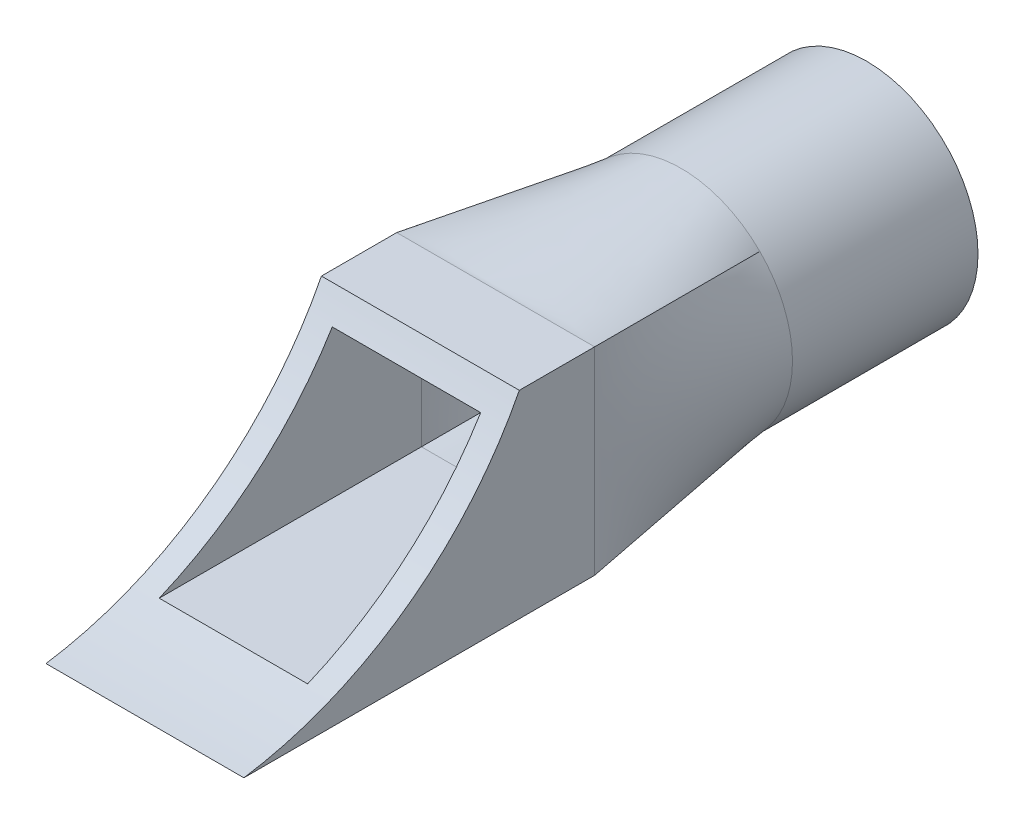
ISO-10303-21;
HEADER;
FILE_DESCRIPTION(('STEP AP214'),'2;1');
FILE_NAME('part.step','',(''),(''),'','','');
FILE_SCHEMA(('AUTOMOTIVE_DESIGN { 1 0 10303 214 1 1 1 1 }'));
ENDSEC;
DATA;
#1=APPLICATION_CONTEXT('core data for automotive mechanical design processes');
#2=APPLICATION_PROTOCOL_DEFINITION('international standard','automotive_design',2000,#1);
#3=PRODUCT_CONTEXT('',#1,'mechanical');
#4=PRODUCT('Part','Part','',(#3));
#5=PRODUCT_RELATED_PRODUCT_CATEGORY('part','',(#4));
#6=PRODUCT_DEFINITION_FORMATION('','',#4);
#7=PRODUCT_DEFINITION_CONTEXT('part definition',#1,'design');
#8=PRODUCT_DEFINITION('design','',#6,#7);
#9=PRODUCT_DEFINITION_SHAPE('','',#8);
#10=(LENGTH_UNIT() NAMED_UNIT(*) SI_UNIT(.MILLI.,.METRE.));
#11=(NAMED_UNIT(*) PLANE_ANGLE_UNIT() SI_UNIT($,.RADIAN.));
#12=(NAMED_UNIT(*) SI_UNIT($,.STERADIAN.) SOLID_ANGLE_UNIT());
#13=UNCERTAINTY_MEASURE_WITH_UNIT(LENGTH_MEASURE(1.E-05),#10,'distance_accuracy_value','');
#14=(GEOMETRIC_REPRESENTATION_CONTEXT(3) GLOBAL_UNCERTAINTY_ASSIGNED_CONTEXT((#13)) GLOBAL_UNIT_ASSIGNED_CONTEXT((#10,
#11,#12)) REPRESENTATION_CONTEXT('',''));
#15=CARTESIAN_POINT('',(0.,0.,0.));
#16=DIRECTION('',(0.,0.,1.));
#17=DIRECTION('',(1.,0.,0.));
#18=AXIS2_PLACEMENT_3D('',#15,#16,#17);
#19=CARTESIAN_POINT('',(-62.7874671161702,176.354700098905,15.));
#20=CARTESIAN_POINT('',(-61.1514281468492,174.718661129584,0.));
#21=CARTESIAN_POINT('',(-62.1208004495035,176.354700098905,15.));
#22=CARTESIAN_POINT('',(-60.7764281468491,175.093661129584,0.));
#23=CARTESIAN_POINT('',(-61.4541337828369,176.354700098905,15.));
#24=CARTESIAN_POINT('',(-60.3540678350133,175.44934816563,0.));
#25=CARTESIAN_POINT('',(-60.1208004495035,176.354700098905,15.));
#26=CARTESIAN_POINT('',(-59.4202889398995,176.09149767305,0.));
#27=CARTESIAN_POINT('',(-59.4541337828368,176.354700098905,15.));
#28=CARTESIAN_POINT('',(-58.9088226708507,176.377752232849,0.));
#29=CARTESIAN_POINT('',(-58.1208004495035,176.354700098905,15.));
#30=CARTESIAN_POINT('',(-57.815303816473,176.851001768948,0.));
#31=CARTESIAN_POINT('',(-57.4541337828368,176.354700098905,15.));
#32=CARTESIAN_POINT('',(-57.233336843669,177.03776478314,0.));
#33=CARTESIAN_POINT('',(-56.1208004495035,176.354700098905,15.));
#34=CARTESIAN_POINT('',(-56.0299679288679,177.289692139469,0.));
#35=CARTESIAN_POINT('',(-55.4541337828368,176.354700098905,15.));
#36=CARTESIAN_POINT('',(-55.4087874597299,177.354700098905,0.));
#37=CARTESIAN_POINT('',(-54.1208004495035,176.354700098905,15.));
#38=CARTESIAN_POINT('',(-54.1661467726106,177.354700098905,0.));
#39=CARTESIAN_POINT('',(-53.4541337828368,176.354700098905,15.));
#40=CARTESIAN_POINT('',(-53.5449663034725,177.289692139469,0.));
#41=CARTESIAN_POINT('',(-52.1208004495035,176.354700098905,15.));
#42=CARTESIAN_POINT('',(-52.3415973886715,177.03776478314,0.));
#43=CARTESIAN_POINT('',(-51.4541337828368,176.354700098905,15.));
#44=CARTESIAN_POINT('',(-51.7596304158674,176.851001768948,0.));
#45=CARTESIAN_POINT('',(-50.1208004495035,176.354700098905,15.));
#46=CARTESIAN_POINT('',(-50.6661115614897,176.377752232849,0.));
#47=CARTESIAN_POINT('',(-49.4541337828369,176.354700098905,15.));
#48=CARTESIAN_POINT('',(-50.1546452924409,176.09149767305,0.));
#49=CARTESIAN_POINT('',(-48.1208004495035,176.354700098905,15.));
#50=CARTESIAN_POINT('',(-49.2208663973272,175.44934816563,0.));
#51=CARTESIAN_POINT('',(-47.4541337828369,176.354700098905,15.));
#52=CARTESIAN_POINT('',(-48.7985060854913,175.093661129584,0.));
#53=CARTESIAN_POINT('',(-46.7874671161702,176.354700098905,15.));
#54=CARTESIAN_POINT('',(-48.4235060854913,174.718661129584,0.));
#55=B_SPLINE_SURFACE_WITH_KNOTS('',3,1,((#19,#20),(#21,#22),(#23,#24),(#25,#26),(#27,#28),(#29,
#30),(#31,#32),(#33,#34),(#35,#36),(#37,#38),(#39,#40),(#41,#42),(#43,#44),(#45,#46),(#47,#48),
(#49,#50),(#51,#52),(#53,#54)),.UNSPECIFIED.,.F.,.F.,.F.,(4,2,2,2,2,2,2,2,4),(2,2),(0.,0.125,
0.25,0.375,0.5,0.625,0.75,0.875,1.),(0.,1.),.UNSPECIFIED.);
#56=DIRECTION('',(1.,0.,0.));
#57=VECTOR('',#56,1.);
#58=CARTESIAN_POINT('',(-62.7874671161702,176.354700098905,15.));
#59=LINE('',#58,#57);
#60=CARTESIAN_POINT('',(-62.7874671161702,176.354700098905,15.));
#61=VERTEX_POINT('',#60);
#62=CARTESIAN_POINT('',(-46.7874671161702,176.354700098905,15.));
#63=VERTEX_POINT('',#62);
#64=EDGE_CURVE('E223',#61,#63,#59,.T.);
#65=DIRECTION('',(-0.107794468345161,-0.107794468345161,-0.988312048488921));
#66=VECTOR('',#65,1.);
#67=CARTESIAN_POINT('',(-47.6054866008308,175.536680614245,7.5));
#68=LINE('',#67,#66);
#69=CARTESIAN_POINT('',(-48.4235060854913,174.718661129584,0.));
#70=VERTEX_POINT('',#69);
#71=EDGE_CURVE('E254',#63,#70,#68,.T.);
#72=CARTESIAN_POINT('',(-54.7874671161702,168.354700098905,0.));
#73=DIRECTION('',(0.,0.,1.));
#74=DIRECTION('',(1.,0.,0.));
#75=AXIS2_PLACEMENT_3D('',#72,#73,#74);
#76=CIRCLE('',#75,9.00000000000001);
#77=CARTESIAN_POINT('',(-61.1514281468492,174.718661129584,0.));
#78=VERTEX_POINT('',#77);
#79=EDGE_CURVE('E120',#70,#78,#76,.T.);
#80=DIRECTION('',(-0.107794468345161,0.107794468345161,0.988312048488921));
#81=VECTOR('',#80,1.);
#82=CARTESIAN_POINT('',(-61.9694476315097,175.536680614245,7.5));
#83=LINE('',#82,#81);
#84=EDGE_CURVE('E240',#78,#61,#83,.T.);
#85=ORIENTED_EDGE('',*,*,#64,.T.);
#86=ORIENTED_EDGE('',*,*,#71,.T.);
#87=ORIENTED_EDGE('',*,*,#79,.T.);
#88=ORIENTED_EDGE('',*,*,#84,.T.);
#89=EDGE_LOOP('',(#85,#86,#87,#88));
#90=FACE_BOUND('',#89,.T.);
#91=ADVANCED_FACE('F99',(#90),#55,.T.);
#92=CARTESIAN_POINT('',(-46.7874671161702,176.354700098905,15.));
#93=CARTESIAN_POINT('',(-48.4235060854913,174.718661129584,0.));
#94=CARTESIAN_POINT('',(-46.7874671161702,175.688033432239,15.));
#95=CARTESIAN_POINT('',(-48.0485060854913,174.343661129584,0.));
#96=CARTESIAN_POINT('',(-46.7874671161702,175.021366765572,15.));
#97=CARTESIAN_POINT('',(-47.6928190494452,173.921300817748,0.));
#98=CARTESIAN_POINT('',(-46.7874671161702,173.688033432238,15.));
#99=CARTESIAN_POINT('',(-47.0506695420258,172.987521922635,0.));
#100=CARTESIAN_POINT('',(-46.7874671161702,173.021366765572,15.));
#101=CARTESIAN_POINT('',(-46.7644149822265,172.476055653586,0.));
#102=CARTESIAN_POINT('',(-46.7874671161702,171.688033432238,15.));
#103=CARTESIAN_POINT('',(-46.2911654461273,171.382536799208,0.));
#104=CARTESIAN_POINT('',(-46.7874671161702,171.021366765572,15.));
#105=CARTESIAN_POINT('',(-46.1044024319358,170.800569826404,0.));
#106=CARTESIAN_POINT('',(-46.7874671161702,169.688033432238,15.));
#107=CARTESIAN_POINT('',(-45.8524750756063,169.597200911603,0.));
#108=CARTESIAN_POINT('',(-46.7874671161702,169.021366765572,15.));
#109=CARTESIAN_POINT('',(-45.7874671161702,168.976020442465,0.));
#110=CARTESIAN_POINT('',(-46.7874671161702,167.688033432238,15.));
#111=CARTESIAN_POINT('',(-45.7874671161702,167.733379755346,0.));
#112=CARTESIAN_POINT('',(-46.7874671161702,167.021366765572,15.));
#113=CARTESIAN_POINT('',(-45.8524750756063,167.112199286207,0.));
#114=CARTESIAN_POINT('',(-46.7874671161702,165.688033432238,15.));
#115=CARTESIAN_POINT('',(-46.1044024319358,165.908830371406,0.));
#116=CARTESIAN_POINT('',(-46.7874671161702,165.021366765572,15.));
#117=CARTESIAN_POINT('',(-46.2911654461273,165.326863398602,0.));
#118=CARTESIAN_POINT('',(-46.7874671161702,163.688033432238,15.));
#119=CARTESIAN_POINT('',(-46.7644149822265,164.233344544225,0.));
#120=CARTESIAN_POINT('',(-46.7874671161702,163.021366765572,15.));
#121=CARTESIAN_POINT('',(-47.0506695420258,163.721878275176,0.));
#122=CARTESIAN_POINT('',(-46.7874671161702,161.688033432239,15.));
#123=CARTESIAN_POINT('',(-47.6928190494452,162.788099380062,0.));
#124=CARTESIAN_POINT('',(-46.7874671161702,161.021366765572,15.));
#125=CARTESIAN_POINT('',(-48.0485060854913,162.365739068226,0.));
#126=CARTESIAN_POINT('',(-46.7874671161702,160.354700098905,15.));
#127=CARTESIAN_POINT('',(-48.4235060854913,161.990739068226,0.));
#128=B_SPLINE_SURFACE_WITH_KNOTS('',3,1,((#92,#93),(#94,#95),(#96,#97),(#98,#99),(#100,#101),
(#102,#103),(#104,#105),(#106,#107),(#108,#109),(#110,#111),(#112,#113),(#114,#115),(#116,#117),
(#118,#119),(#120,#121),(#122,#123),(#124,#125),(#126,#127)),.UNSPECIFIED.,.F.,.F.,.F.,(4,2,2,2,
2,2,2,2,4),(2,2),(0.,0.125,0.25,0.375,0.5,0.625,0.75,0.875,1.),(0.,1.),.UNSPECIFIED.);
#129=DIRECTION('',(0.,1.,0.));
#130=VECTOR('',#129,1.);
#131=CARTESIAN_POINT('',(-46.7874671161702,160.354700098905,15.));
#132=LINE('',#131,#130);
#133=CARTESIAN_POINT('',(-46.7874671161702,160.354700098905,15.));
#134=VERTEX_POINT('',#133);
#135=EDGE_CURVE('E129',#134,#63,#132,.T.);
#136=DIRECTION('',(-0.107794468345161,0.107794468345161,-0.988312048488921));
#137=VECTOR('',#136,1.);
#138=CARTESIAN_POINT('',(-47.6054866008308,161.172719583566,7.5));
#139=LINE('',#138,#137);
#140=CARTESIAN_POINT('',(-48.4235060854913,161.990739068226,0.));
#141=VERTEX_POINT('',#140);
#142=EDGE_CURVE('E235',#134,#141,#139,.T.);
#143=EDGE_CURVE('E112',#141,#70,#76,.T.);
#144=ORIENTED_EDGE('',*,*,#135,.F.);
#145=ORIENTED_EDGE('',*,*,#142,.T.);
#146=ORIENTED_EDGE('',*,*,#143,.T.);
#147=ORIENTED_EDGE('',*,*,#71,.F.);
#148=EDGE_LOOP('',(#144,#145,#146,#147));
#149=FACE_BOUND('',#148,.T.);
#150=ADVANCED_FACE('F273',(#149),#128,.T.);
#151=CARTESIAN_POINT('',(-62.7874671161702,160.354700098905,15.));
#152=CARTESIAN_POINT('',(-61.1514281468492,161.990739068226,0.));
#153=CARTESIAN_POINT('',(-62.7874671161702,161.021366765572,15.));
#154=CARTESIAN_POINT('',(-61.5264281468492,162.365739068226,0.));
#155=CARTESIAN_POINT('',(-62.7874671161702,161.688033432239,15.));
#156=CARTESIAN_POINT('',(-61.8821151828953,162.788099380062,0.));
#157=CARTESIAN_POINT('',(-62.7874671161702,163.021366765572,15.));
#158=CARTESIAN_POINT('',(-62.5242646903147,163.721878275176,0.));
#159=CARTESIAN_POINT('',(-62.7874671161702,163.688033432239,15.));
#160=CARTESIAN_POINT('',(-62.8105192501139,164.233344544225,0.));
#161=CARTESIAN_POINT('',(-62.7874671161702,165.021366765572,15.));
#162=CARTESIAN_POINT('',(-63.2837687862132,165.326863398602,0.));
#163=CARTESIAN_POINT('',(-62.7874671161702,165.688033432239,15.));
#164=CARTESIAN_POINT('',(-63.4705318004047,165.908830371406,0.));
#165=CARTESIAN_POINT('',(-62.7874671161702,167.021366765572,15.));
#166=CARTESIAN_POINT('',(-63.7224591567341,167.112199286208,0.));
#167=CARTESIAN_POINT('',(-62.7874671161702,167.688033432239,15.));
#168=CARTESIAN_POINT('',(-63.7874671161702,167.733379755346,0.));
#169=CARTESIAN_POINT('',(-62.7874671161702,169.021366765572,15.));
#170=CARTESIAN_POINT('',(-63.7874671161703,168.976020442465,0.));
#171=CARTESIAN_POINT('',(-62.7874671161702,169.688033432239,15.));
#172=CARTESIAN_POINT('',(-63.7224591567341,169.597200911603,0.));
#173=CARTESIAN_POINT('',(-62.7874671161702,171.021366765572,15.));
#174=CARTESIAN_POINT('',(-63.4705318004047,170.800569826404,0.));
#175=CARTESIAN_POINT('',(-62.7874671161702,171.688033432239,15.));
#176=CARTESIAN_POINT('',(-63.2837687862131,171.382536799208,0.));
#177=CARTESIAN_POINT('',(-62.7874671161702,173.021366765572,15.));
#178=CARTESIAN_POINT('',(-62.810519250114,172.476055653586,0.));
#179=CARTESIAN_POINT('',(-62.7874671161702,173.688033432239,15.));
#180=CARTESIAN_POINT('',(-62.5242646903147,172.987521922635,0.));
#181=CARTESIAN_POINT('',(-62.7874671161702,175.021366765572,15.));
#182=CARTESIAN_POINT('',(-61.8821151828953,173.921300817748,0.));
#183=CARTESIAN_POINT('',(-62.7874671161702,175.688033432239,15.));
#184=CARTESIAN_POINT('',(-61.5264281468492,174.343661129584,0.));
#185=CARTESIAN_POINT('',(-62.7874671161702,176.354700098905,15.));
#186=CARTESIAN_POINT('',(-61.1514281468492,174.718661129584,0.));
#187=B_SPLINE_SURFACE_WITH_KNOTS('',3,1,((#151,#152),(#153,#154),(#155,#156),(#157,#158),(#159,
#160),(#161,#162),(#163,#164),(#165,#166),(#167,#168),(#169,#170),(#171,#172),(#173,#174),(#175,
#176),(#177,#178),(#179,#180),(#181,#182),(#183,#184),(#185,#186)),.UNSPECIFIED.,.F.,.F.,.F.,(4,
2,2,2,2,2,2,2,4),(2,2),(0.,0.125,0.25,0.375,0.5,0.624999999999999,0.749999999999999,
0.874999999999999,1.),(0.,1.),.UNSPECIFIED.);
#188=DIRECTION('',(0.,1.,0.));
#189=VECTOR('',#188,1.);
#190=CARTESIAN_POINT('',(-62.7874671161702,160.354700098905,15.));
#191=LINE('',#190,#189);
#192=CARTESIAN_POINT('',(-62.7874671161702,160.354700098905,15.));
#193=VERTEX_POINT('',#192);
#194=EDGE_CURVE('E212',#193,#61,#191,.T.);
#195=CARTESIAN_POINT('',(-61.1514281468492,161.990739068226,0.));
#196=VERTEX_POINT('',#195);
#197=EDGE_CURVE('E232',#78,#196,#76,.T.);
#198=DIRECTION('',(0.10779446834516,0.107794468345161,-0.988312048488921));
#199=VECTOR('',#198,1.);
#200=CARTESIAN_POINT('',(-61.9694476315097,161.172719583566,7.5));
#201=LINE('',#200,#199);
#202=EDGE_CURVE('E230',#193,#196,#201,.T.);
#203=ORIENTED_EDGE('',*,*,#194,.T.);
#204=ORIENTED_EDGE('',*,*,#84,.F.);
#205=ORIENTED_EDGE('',*,*,#197,.T.);
#206=ORIENTED_EDGE('',*,*,#202,.F.);
#207=EDGE_LOOP('',(#203,#204,#205,#206));
#208=FACE_BOUND('',#207,.T.);
#209=ADVANCED_FACE('F231',(#208),#187,.T.);
#210=CARTESIAN_POINT('',(-46.7874671161702,160.354700098905,15.));
#211=CARTESIAN_POINT('',(-48.4235060854913,161.990739068226,0.));
#212=CARTESIAN_POINT('',(-47.4541337828368,160.354700098905,15.));
#213=CARTESIAN_POINT('',(-48.7985060854913,161.615739068226,0.));
#214=CARTESIAN_POINT('',(-48.1208004495034,160.354700098905,15.));
#215=CARTESIAN_POINT('',(-49.2208663973272,161.26005203218,0.));
#216=CARTESIAN_POINT('',(-49.4541337828366,160.354700098905,15.));
#217=CARTESIAN_POINT('',(-50.1546452924409,160.617902524761,0.));
#218=CARTESIAN_POINT('',(-50.1208004495032,160.354700098905,15.));
#219=CARTESIAN_POINT('',(-50.6661115614897,160.331647964961,0.));
#220=CARTESIAN_POINT('',(-51.4541337828365,160.354700098905,15.));
#221=CARTESIAN_POINT('',(-51.7596304158674,159.858398428862,0.));
#222=CARTESIAN_POINT('',(-52.1208004495031,160.354700098905,15.));
#223=CARTESIAN_POINT('',(-52.3415973886715,159.671635414671,0.));
#224=CARTESIAN_POINT('',(-53.4541337828364,160.354700098905,15.));
#225=CARTESIAN_POINT('',(-53.5449663034725,159.419708058341,0.));
#226=CARTESIAN_POINT('',(-54.120800449503,160.354700098905,15.));
#227=CARTESIAN_POINT('',(-54.1661467726106,159.354700098905,0.));
#228=CARTESIAN_POINT('',(-55.4541337828364,160.354700098905,15.));
#229=CARTESIAN_POINT('',(-55.4087874597299,159.354700098905,0.));
#230=CARTESIAN_POINT('',(-56.120800449503,160.354700098905,15.));
#231=CARTESIAN_POINT('',(-56.0299679288679,159.419708058341,0.));
#232=CARTESIAN_POINT('',(-57.4541337828364,160.354700098905,15.));
#233=CARTESIAN_POINT('',(-57.233336843669,159.671635414671,0.));
#234=CARTESIAN_POINT('',(-58.1208004495031,160.354700098905,15.));
#235=CARTESIAN_POINT('',(-57.815303816473,159.858398428862,0.));
#236=CARTESIAN_POINT('',(-59.4541337828365,160.354700098905,15.));
#237=CARTESIAN_POINT('',(-58.9088226708507,160.331647964961,0.));
#238=CARTESIAN_POINT('',(-60.1208004495033,160.354700098905,15.));
#239=CARTESIAN_POINT('',(-59.4202889398996,160.617902524761,0.));
#240=CARTESIAN_POINT('',(-61.4541337828367,160.354700098905,15.));
#241=CARTESIAN_POINT('',(-60.3540678350133,161.26005203218,0.));
#242=CARTESIAN_POINT('',(-62.1208004495035,160.354700098905,15.));
#243=CARTESIAN_POINT('',(-60.7764281468492,161.615739068226,0.));
#244=CARTESIAN_POINT('',(-62.7874671161702,160.354700098905,15.));
#245=CARTESIAN_POINT('',(-61.1514281468492,161.990739068226,0.));
#246=B_SPLINE_SURFACE_WITH_KNOTS('',3,1,((#210,#211),(#212,#213),(#214,#215),(#216,#217),(#218,
#219),(#220,#221),(#222,#223),(#224,#225),(#226,#227),(#228,#229),(#230,#231),(#232,#233),(#234,
#235),(#236,#237),(#238,#239),(#240,#241),(#242,#243),(#244,#245)),.UNSPECIFIED.,.F.,.F.,.F.,(4,
2,2,2,2,2,2,2,4),(2,2),(0.,0.125,0.25,0.375,0.5,0.625,0.75,0.875,1.),(0.,1.),.UNSPECIFIED.);
#247=DIRECTION('',(1.,0.,0.));
#248=VECTOR('',#247,1.);
#249=CARTESIAN_POINT('',(-62.7874671161702,160.354700098905,15.));
#250=LINE('',#249,#248);
#251=EDGE_CURVE('E203',#193,#134,#250,.T.);
#252=EDGE_CURVE('E12',#196,#141,#76,.T.);
#253=ORIENTED_EDGE('',*,*,#251,.F.);
#254=ORIENTED_EDGE('',*,*,#202,.T.);
#255=ORIENTED_EDGE('',*,*,#252,.T.);
#256=ORIENTED_EDGE('',*,*,#142,.F.);
#257=EDGE_LOOP('',(#253,#254,#255,#256));
#258=FACE_BOUND('',#257,.T.);
#259=ADVANCED_FACE('F101',(#258),#246,.T.);
#260=CARTESIAN_POINT('',(-59.7372145844761,173.304447567211,0.));
#261=CARTESIAN_POINT('',(-60.7874671161702,174.354700098905,15.));
#262=CARTESIAN_POINT('',(-60.0288812511427,173.012780900544,0.));
#263=CARTESIAN_POINT('',(-60.7874671161702,173.854700098906,15.));
#264=CARTESIAN_POINT('',(-60.3055267236231,172.684278435783,0.));
#265=CARTESIAN_POINT('',(-60.7874671161702,173.354700098906,15.));
#266=CARTESIAN_POINT('',(-60.8049763405048,171.958005961806,0.));
#267=CARTESIAN_POINT('',(-60.7874671161702,172.354700098906,15.));
#268=CARTESIAN_POINT('',(-61.0276187759042,171.560198863657,0.));
#269=CARTESIAN_POINT('',(-60.7874671161702,171.854700098907,15.));
#270=CARTESIAN_POINT('',(-61.3957017484258,170.709684199141,0.));
#271=CARTESIAN_POINT('',(-60.7874671161702,170.854700098907,15.));
#272=CARTESIAN_POINT('',(-61.5409618705748,170.257043220293,0.));
#273=CARTESIAN_POINT('',(-60.7874671161702,170.354700098907,15.));
#274=CARTESIAN_POINT('',(-61.7369053699421,169.321089619892,0.));
#275=CARTESIAN_POINT('',(-60.7874671161702,169.354700098907,15.));
#276=CARTESIAN_POINT('',(-61.7874671161702,168.837949255007,0.));
#277=CARTESIAN_POINT('',(-60.7874671161702,168.854700098907,15.));
#278=CARTESIAN_POINT('',(-61.7874671161702,167.871450942803,0.));
#279=CARTESIAN_POINT('',(-60.7874671161702,167.854700098907,15.));
#280=CARTESIAN_POINT('',(-61.7369053699421,167.388310577918,0.));
#281=CARTESIAN_POINT('',(-60.7874671161702,167.354700098907,15.));
#282=CARTESIAN_POINT('',(-61.5409618705748,166.452356977517,0.));
#283=CARTESIAN_POINT('',(-60.7874671161702,166.354700098907,15.));
#284=CARTESIAN_POINT('',(-61.3957017484258,165.99971599867,0.));
#285=CARTESIAN_POINT('',(-60.7874671161702,165.854700098907,15.));
#286=CARTESIAN_POINT('',(-61.0276187759042,165.149201334154,0.));
#287=CARTESIAN_POINT('',(-60.7874671161702,164.854700098906,15.));
#288=CARTESIAN_POINT('',(-60.8049763405048,164.751394236005,0.));
#289=CARTESIAN_POINT('',(-60.7874671161702,164.354700098906,15.));
#290=CARTESIAN_POINT('',(-60.3055267236231,164.025121762027,0.));
#291=CARTESIAN_POINT('',(-60.7874671161702,163.354700098906,15.));
#292=CARTESIAN_POINT('',(-60.0288812511427,163.696619297266,0.));
#293=CARTESIAN_POINT('',(-60.7874671161702,162.854700098906,15.));
#294=CARTESIAN_POINT('',(-59.7372145844761,163.404952630599,0.));
#295=CARTESIAN_POINT('',(-60.7874671161702,162.354700098905,15.));
#296=B_SPLINE_SURFACE_WITH_KNOTS('',3,1,((#260,#261),(#262,#263),(#264,#265),(#266,#267),(#268,
#269),(#270,#271),(#272,#273),(#274,#275),(#276,#277),(#278,#279),(#280,#281),(#282,#283),(#284,
#285),(#286,#287),(#288,#289),(#290,#291),(#292,#293),(#294,#295)),.UNSPECIFIED.,.F.,.F.,.F.,(4,
2,2,2,2,2,2,2,4),(2,2),(0.,0.125,0.25,0.375,0.5,0.625,0.75,0.875,1.),(0.,1.),.UNSPECIFIED.);
#297=CARTESIAN_POINT('',(-54.7874671161702,168.354700098905,0.));
#298=DIRECTION('',(0.,0.,1.));
#299=DIRECTION('',(1.,0.,0.));
#300=AXIS2_PLACEMENT_3D('',#297,#298,#299);
#301=CIRCLE('',#300,7.);
#302=CARTESIAN_POINT('',(-59.7372145844761,173.304447567211,0.));
#303=VERTEX_POINT('',#302);
#304=CARTESIAN_POINT('',(-59.7372145844761,163.404952630599,0.));
#305=VERTEX_POINT('',#304);
#306=EDGE_CURVE('E324',#303,#305,#301,.T.);
#307=DIRECTION('',(0.0696760915409141,-0.0696760915409136,-0.995133400371611));
#308=VECTOR('',#307,1.);
#309=CARTESIAN_POINT('',(-60.2623408503231,173.829573833058,7.5));
#310=LINE('',#309,#308);
#311=CARTESIAN_POINT('',(-60.7874671161702,174.354700098905,15.));
#312=VERTEX_POINT('',#311);
#313=EDGE_CURVE('E310',#312,#303,#310,.T.);
#314=DIRECTION('',(0.,1.,0.));
#315=VECTOR('',#314,1.);
#316=CARTESIAN_POINT('',(-60.7874671161702,162.354700098905,15.));
#317=LINE('',#316,#315);
#318=CARTESIAN_POINT('',(-60.7874671161702,162.354700098905,15.));
#319=VERTEX_POINT('',#318);
#320=EDGE_CURVE('E488',#319,#312,#317,.T.);
#321=DIRECTION('',(-0.0696760915409141,-0.0696760915409136,0.995133400371611));
#322=VECTOR('',#321,1.);
#323=CARTESIAN_POINT('',(-60.2623408503231,162.879826364752,7.5));
#324=LINE('',#323,#322);
#325=EDGE_CURVE('E481',#305,#319,#324,.T.);
#326=ORIENTED_EDGE('',*,*,#306,.F.);
#327=ORIENTED_EDGE('',*,*,#313,.F.);
#328=ORIENTED_EDGE('',*,*,#320,.F.);
#329=ORIENTED_EDGE('',*,*,#325,.F.);
#330=EDGE_LOOP('',(#326,#327,#328,#329));
#331=FACE_BOUND('',#330,.T.);
#332=ADVANCED_FACE('F495',(#331),#296,.F.);
#333=CARTESIAN_POINT('',(-59.7372145844761,163.404952630599,0.));
#334=CARTESIAN_POINT('',(-60.7874671161702,162.354700098905,15.));
#335=CARTESIAN_POINT('',(-59.4455479178094,163.113285963933,0.));
#336=CARTESIAN_POINT('',(-60.2874671161702,162.354700098905,15.));
#337=CARTESIAN_POINT('',(-59.1170454530481,162.836640491452,0.));
#338=CARTESIAN_POINT('',(-59.7874671161702,162.354700098905,15.));
#339=CARTESIAN_POINT('',(-58.3907729790708,162.337190874571,0.));
#340=CARTESIAN_POINT('',(-58.7874671161702,162.354700098905,15.));
#341=CARTESIAN_POINT('',(-57.9929658809217,162.114548439171,0.));
#342=CARTESIAN_POINT('',(-58.2874671161702,162.354700098905,15.));
#343=CARTESIAN_POINT('',(-57.1424512164057,161.74646546665,0.));
#344=CARTESIAN_POINT('',(-57.2874671161702,162.354700098905,15.));
#345=CARTESIAN_POINT('',(-56.6898102375581,161.601205344501,0.));
#346=CARTESIAN_POINT('',(-56.7874671161702,162.354700098905,15.));
#347=CARTESIAN_POINT('',(-55.7538566371573,161.405261845133,0.));
#348=CARTESIAN_POINT('',(-55.7874671161702,162.354700098905,15.));
#349=CARTESIAN_POINT('',(-55.2707162722722,161.354700098905,0.));
#350=CARTESIAN_POINT('',(-55.2874671161702,162.354700098905,15.));
#351=CARTESIAN_POINT('',(-54.3042179600683,161.354700098905,0.));
#352=CARTESIAN_POINT('',(-54.2874671161702,162.354700098905,15.));
#353=CARTESIAN_POINT('',(-53.8210775951832,161.405261845133,0.));
#354=CARTESIAN_POINT('',(-53.7874671161702,162.354700098905,15.));
#355=CARTESIAN_POINT('',(-52.8851239947823,161.601205344501,0.));
#356=CARTESIAN_POINT('',(-52.7874671161702,162.354700098905,15.));
#357=CARTESIAN_POINT('',(-52.4324830159347,161.74646546665,0.));
#358=CARTESIAN_POINT('',(-52.2874671161702,162.354700098905,15.));
#359=CARTESIAN_POINT('',(-51.5819683514188,162.114548439171,0.));
#360=CARTESIAN_POINT('',(-51.2874671161702,162.354700098905,15.));
#361=CARTESIAN_POINT('',(-51.1841612532696,162.337190874571,0.));
#362=CARTESIAN_POINT('',(-50.7874671161702,162.354700098905,15.));
#363=CARTESIAN_POINT('',(-50.4578887792923,162.836640491452,0.));
#364=CARTESIAN_POINT('',(-49.7874671161702,162.354700098905,15.));
#365=CARTESIAN_POINT('',(-50.1293863145311,163.113285963933,0.));
#366=CARTESIAN_POINT('',(-49.2874671161702,162.354700098905,15.));
#367=CARTESIAN_POINT('',(-49.8377196478644,163.404952630599,0.));
#368=CARTESIAN_POINT('',(-48.7874671161702,162.354700098905,15.));
#369=B_SPLINE_SURFACE_WITH_KNOTS('',3,1,((#333,#334),(#335,#336),(#337,#338),(#339,#340),(#341,
#342),(#343,#344),(#345,#346),(#347,#348),(#349,#350),(#351,#352),(#353,#354),(#355,#356),(#357,
#358),(#359,#360),(#361,#362),(#363,#364),(#365,#366),(#367,#368)),.UNSPECIFIED.,.F.,.F.,.F.,(4,
2,2,2,2,2,2,2,4),(2,2),(0.,0.125,0.25,0.375,0.5,0.625,0.75,0.875,1.),(0.,1.),.UNSPECIFIED.);
#370=CARTESIAN_POINT('',(-49.8377196478644,163.404952630599,0.));
#371=VERTEX_POINT('',#370);
#372=EDGE_CURVE('E312',#305,#371,#301,.T.);
#373=DIRECTION('',(1.,0.,0.));
#374=VECTOR('',#373,1.);
#375=CARTESIAN_POINT('',(-60.7874671161702,162.354700098905,15.));
#376=LINE('',#375,#374);
#377=CARTESIAN_POINT('',(-48.7874671161702,162.354700098905,15.));
#378=VERTEX_POINT('',#377);
#379=EDGE_CURVE('E224',#319,#378,#376,.T.);
#380=DIRECTION('',(0.0696760915409146,-0.0696760915409136,0.995133400371611));
#381=VECTOR('',#380,1.);
#382=CARTESIAN_POINT('',(-49.3125933820173,162.879826364752,7.5));
#383=LINE('',#382,#381);
#384=EDGE_CURVE('E607',#371,#378,#383,.T.);
#385=ORIENTED_EDGE('',*,*,#372,.F.);
#386=ORIENTED_EDGE('',*,*,#325,.T.);
#387=ORIENTED_EDGE('',*,*,#379,.T.);
#388=ORIENTED_EDGE('',*,*,#384,.F.);
#389=EDGE_LOOP('',(#385,#386,#387,#388));
#390=FACE_BOUND('',#389,.T.);
#391=ADVANCED_FACE('F506',(#390),#369,.F.);
#392=CARTESIAN_POINT('',(-49.8377196478644,173.304447567211,0.));
#393=CARTESIAN_POINT('',(-48.7874671161702,174.354700098905,15.));
#394=CARTESIAN_POINT('',(-50.1293863145311,173.596114233878,0.));
#395=CARTESIAN_POINT('',(-49.2874671161702,174.354700098905,15.));
#396=CARTESIAN_POINT('',(-50.4578887792923,173.872759706358,0.));
#397=CARTESIAN_POINT('',(-49.7874671161702,174.354700098905,15.));
#398=CARTESIAN_POINT('',(-51.1841612532696,174.37220932324,0.));
#399=CARTESIAN_POINT('',(-50.7874671161702,174.354700098905,15.));
#400=CARTESIAN_POINT('',(-51.5819683514188,174.594851758639,0.));
#401=CARTESIAN_POINT('',(-51.2874671161703,174.354700098905,15.));
#402=CARTESIAN_POINT('',(-52.4324830159347,174.962934731161,0.));
#403=CARTESIAN_POINT('',(-52.2874671161703,174.354700098905,15.));
#404=CARTESIAN_POINT('',(-52.8851239947823,175.10819485331,0.));
#405=CARTESIAN_POINT('',(-52.7874671161703,174.354700098905,15.));
#406=CARTESIAN_POINT('',(-53.8210775951831,175.304138352677,0.));
#407=CARTESIAN_POINT('',(-53.7874671161703,174.354700098905,15.));
#408=CARTESIAN_POINT('',(-54.3042179600683,175.354700098905,0.));
#409=CARTESIAN_POINT('',(-54.2874671161703,174.354700098905,15.));
#410=CARTESIAN_POINT('',(-55.2707162722722,175.354700098905,0.));
#411=CARTESIAN_POINT('',(-55.2874671161703,174.354700098905,15.));
#412=CARTESIAN_POINT('',(-55.7538566371573,175.304138352677,0.));
#413=CARTESIAN_POINT('',(-55.7874671161703,174.354700098905,15.));
#414=CARTESIAN_POINT('',(-56.6898102375581,175.10819485331,0.));
#415=CARTESIAN_POINT('',(-56.7874671161702,174.354700098905,15.));
#416=CARTESIAN_POINT('',(-57.1424512164058,174.962934731161,0.));
#417=CARTESIAN_POINT('',(-57.2874671161703,174.354700098905,15.));
#418=CARTESIAN_POINT('',(-57.9929658809218,174.594851758639,0.));
#419=CARTESIAN_POINT('',(-58.2874671161702,174.354700098905,15.));
#420=CARTESIAN_POINT('',(-58.3907729790708,174.37220932324,0.));
#421=CARTESIAN_POINT('',(-58.7874671161702,174.354700098905,15.));
#422=CARTESIAN_POINT('',(-59.1170454530482,173.872759706358,0.));
#423=CARTESIAN_POINT('',(-59.7874671161702,174.354700098905,15.));
#424=CARTESIAN_POINT('',(-59.4455479178094,173.596114233878,0.));
#425=CARTESIAN_POINT('',(-60.2874671161702,174.354700098905,15.));
#426=CARTESIAN_POINT('',(-59.7372145844761,173.304447567211,0.));
#427=CARTESIAN_POINT('',(-60.7874671161702,174.354700098905,15.));
#428=B_SPLINE_SURFACE_WITH_KNOTS('',3,1,((#392,#393),(#394,#395),(#396,#397),(#398,#399),(#400,
#401),(#402,#403),(#404,#405),(#406,#407),(#408,#409),(#410,#411),(#412,#413),(#414,#415),(#416,
#417),(#418,#419),(#420,#421),(#422,#423),(#424,#425),(#426,#427)),.UNSPECIFIED.,.F.,.F.,.F.,(4,
2,2,2,2,2,2,2,4),(2,2),(0.,0.125,0.25,0.375,0.5,0.625,0.75,0.875,1.),(0.,1.),.UNSPECIFIED.);
#429=CARTESIAN_POINT('',(-49.8377196478644,173.304447567211,0.));
#430=VERTEX_POINT('',#429);
#431=EDGE_CURVE('E311',#430,#303,#301,.T.);
#432=DIRECTION('',(0.0696760915409141,0.0696760915409136,0.995133400371611));
#433=VECTOR('',#432,1.);
#434=CARTESIAN_POINT('',(-49.3125933820173,173.829573833058,7.5));
#435=LINE('',#434,#433);
#436=CARTESIAN_POINT('',(-48.7874671161702,174.354700098905,15.));
#437=VERTEX_POINT('',#436);
#438=EDGE_CURVE('E606',#430,#437,#435,.T.);
#439=DIRECTION('',(1.,0.,0.));
#440=VECTOR('',#439,1.);
#441=CARTESIAN_POINT('',(-60.7874671161702,174.354700098905,15.));
#442=LINE('',#441,#440);
#443=EDGE_CURVE('E106',#312,#437,#442,.T.);
#444=ORIENTED_EDGE('',*,*,#431,.F.);
#445=ORIENTED_EDGE('',*,*,#438,.T.);
#446=ORIENTED_EDGE('',*,*,#443,.F.);
#447=ORIENTED_EDGE('',*,*,#313,.T.);
#448=EDGE_LOOP('',(#444,#445,#446,#447));
#449=FACE_BOUND('',#448,.T.);
#450=ADVANCED_FACE('F440',(#449),#428,.F.);
#451=CARTESIAN_POINT('',(-49.8377196478644,163.404952630599,0.));
#452=CARTESIAN_POINT('',(-48.7874671161702,162.354700098905,15.));
#453=CARTESIAN_POINT('',(-49.5460529811977,163.696619297266,0.));
#454=CARTESIAN_POINT('',(-48.7874671161702,162.854700098905,15.));
#455=CARTESIAN_POINT('',(-49.2694075087174,164.025121762027,0.));
#456=CARTESIAN_POINT('',(-48.7874671161702,163.354700098905,15.));
#457=CARTESIAN_POINT('',(-48.7699578918357,164.751394236005,0.));
#458=CARTESIAN_POINT('',(-48.7874671161702,164.354700098905,15.));
#459=CARTESIAN_POINT('',(-48.5473154564362,165.149201334154,0.));
#460=CARTESIAN_POINT('',(-48.7874671161702,164.854700098905,15.));
#461=CARTESIAN_POINT('',(-48.1792324839146,165.99971599867,0.));
#462=CARTESIAN_POINT('',(-48.7874671161702,165.854700098905,15.));
#463=CARTESIAN_POINT('',(-48.0339723617657,166.452356977517,0.));
#464=CARTESIAN_POINT('',(-48.7874671161702,166.354700098905,15.));
#465=CARTESIAN_POINT('',(-47.8380288623983,167.388310577918,0.));
#466=CARTESIAN_POINT('',(-48.7874671161702,167.354700098905,15.));
#467=CARTESIAN_POINT('',(-47.7874671161702,167.871450942803,0.));
#468=CARTESIAN_POINT('',(-48.7874671161702,167.854700098905,15.));
#469=CARTESIAN_POINT('',(-47.7874671161702,168.837949255007,0.));
#470=CARTESIAN_POINT('',(-48.7874671161702,168.854700098905,15.));
#471=CARTESIAN_POINT('',(-47.8380288623983,169.321089619892,0.));
#472=CARTESIAN_POINT('',(-48.7874671161702,169.354700098905,15.));
#473=CARTESIAN_POINT('',(-48.0339723617657,170.257043220293,0.));
#474=CARTESIAN_POINT('',(-48.7874671161702,170.354700098905,15.));
#475=CARTESIAN_POINT('',(-48.1792324839146,170.709684199141,0.));
#476=CARTESIAN_POINT('',(-48.7874671161702,170.854700098905,15.));
#477=CARTESIAN_POINT('',(-48.5473154564362,171.560198863657,0.));
#478=CARTESIAN_POINT('',(-48.7874671161702,171.854700098905,15.));
#479=CARTESIAN_POINT('',(-48.7699578918357,171.958005961806,0.));
#480=CARTESIAN_POINT('',(-48.7874671161702,172.354700098905,15.));
#481=CARTESIAN_POINT('',(-49.2694075087174,172.684278435783,0.));
#482=CARTESIAN_POINT('',(-48.7874671161702,173.354700098905,15.));
#483=CARTESIAN_POINT('',(-49.5460529811977,173.012780900544,0.));
#484=CARTESIAN_POINT('',(-48.7874671161702,173.854700098905,15.));
#485=CARTESIAN_POINT('',(-49.8377196478644,173.304447567211,0.));
#486=CARTESIAN_POINT('',(-48.7874671161702,174.354700098905,15.));
#487=B_SPLINE_SURFACE_WITH_KNOTS('',3,1,((#451,#452),(#453,#454),(#455,#456),(#457,#458),(#459,
#460),(#461,#462),(#463,#464),(#465,#466),(#467,#468),(#469,#470),(#471,#472),(#473,#474),(#475,
#476),(#477,#478),(#479,#480),(#481,#482),(#483,#484),(#485,#486)),.UNSPECIFIED.,.F.,.F.,.F.,(4,
2,2,2,2,2,2,2,4),(2,2),(0.,0.125,0.25,0.375,0.5,0.625,0.75,0.875,1.),(0.,1.),.UNSPECIFIED.);
#488=EDGE_CURVE('E306',#371,#430,#301,.T.);
#489=DIRECTION('',(0.,1.,0.));
#490=VECTOR('',#489,1.);
#491=CARTESIAN_POINT('',(-48.7874671161702,162.354700098905,15.));
#492=LINE('',#491,#490);
#493=EDGE_CURVE('E550',#378,#437,#492,.T.);
#494=ORIENTED_EDGE('',*,*,#488,.F.);
#495=ORIENTED_EDGE('',*,*,#384,.T.);
#496=ORIENTED_EDGE('',*,*,#493,.T.);
#497=ORIENTED_EDGE('',*,*,#438,.F.);
#498=EDGE_LOOP('',(#494,#495,#496,#497));
#499=FACE_BOUND('',#498,.T.);
#500=ADVANCED_FACE('F427',(#499),#487,.F.);
#501=CARTESIAN_POINT('',(-54.7874671161702,168.354700098905,-15.));
#502=DIRECTION('',(0.,0.,1.));
#503=DIRECTION('',(1.,0.,0.));
#504=AXIS2_PLACEMENT_3D('',#501,#502,#503);
#505=CYLINDRICAL_SURFACE('',#504,9.00000000000001);
#506=CARTESIAN_POINT('',(-54.7874671161702,168.354700098905,-15.));
#507=DIRECTION('',(0.,0.,1.));
#508=DIRECTION('',(1.,0.,0.));
#509=AXIS2_PLACEMENT_3D('',#506,#507,#508);
#510=CIRCLE('',#509,9.00000000000001);
#511=CARTESIAN_POINT('',(-45.7874671161702,168.354700098905,-15.));
#512=VERTEX_POINT('',#511);
#513=EDGE_CURVE('E631',#512,#512,#510,.T.);
#514=ORIENTED_EDGE('',*,*,#513,.T.);
#515=EDGE_LOOP('',(#514));
#516=FACE_BOUND('',#515,.T.);
#517=ORIENTED_EDGE('',*,*,#79,.F.);
#518=ORIENTED_EDGE('',*,*,#143,.F.);
#519=ORIENTED_EDGE('',*,*,#252,.F.);
#520=ORIENTED_EDGE('',*,*,#197,.F.);
#521=EDGE_LOOP('',(#517,#518,#519,#520));
#522=FACE_BOUND('',#521,.T.);
#523=ADVANCED_FACE('F439',(#516,#522),#505,.T.);
#524=CARTESIAN_POINT('',(-54.7874671161702,168.354700098905,-15.));
#525=DIRECTION('',(0.,0.,1.));
#526=DIRECTION('',(1.,0.,0.));
#527=AXIS2_PLACEMENT_3D('',#524,#525,#526);
#528=PLANE('',#527);
#529=CARTESIAN_POINT('',(-54.7874671161702,168.354700098905,-15.));
#530=DIRECTION('',(0.,0.,1.));
#531=DIRECTION('',(1.,0.,0.));
#532=AXIS2_PLACEMENT_3D('',#529,#530,#531);
#533=CIRCLE('',#532,7.);
#534=CARTESIAN_POINT('',(-47.7874671161702,168.354700098905,-15.));
#535=VERTEX_POINT('',#534);
#536=EDGE_CURVE('E657',#535,#535,#533,.T.);
#537=ORIENTED_EDGE('',*,*,#536,.T.);
#538=EDGE_LOOP('',(#537));
#539=FACE_BOUND('',#538,.T.);
#540=ORIENTED_EDGE('',*,*,#513,.F.);
#541=EDGE_LOOP('',(#540));
#542=FACE_BOUND('',#541,.T.);
#543=ADVANCED_FACE('F645',(#539,#542),#528,.F.);
#544=CARTESIAN_POINT('',(-54.7874671161702,168.354700098905,-15.));
#545=DIRECTION('',(0.,0.,1.));
#546=DIRECTION('',(1.,0.,0.));
#547=AXIS2_PLACEMENT_3D('',#544,#545,#546);
#548=CYLINDRICAL_SURFACE('',#547,7.);
#549=ORIENTED_EDGE('',*,*,#536,.F.);
#550=EDGE_LOOP('',(#549));
#551=FACE_BOUND('',#550,.T.);
#552=ORIENTED_EDGE('',*,*,#431,.T.);
#553=ORIENTED_EDGE('',*,*,#306,.T.);
#554=ORIENTED_EDGE('',*,*,#372,.T.);
#555=ORIENTED_EDGE('',*,*,#488,.T.);
#556=EDGE_LOOP('',(#552,#553,#554,#555));
#557=FACE_BOUND('',#556,.T.);
#558=ADVANCED_FACE('F351',(#551,#557),#548,.F.);
#559=CARTESIAN_POINT('',(0.,176.354700098905,47.7923634552458));
#560=DIRECTION('',(0.,1.,0.));
#561=DIRECTION('',(0.,0.,1.));
#562=AXIS2_PLACEMENT_3D('',#559,#560,#561);
#563=PLANE('',#562);
#564=DIRECTION('',(1.,0.,0.));
#565=VECTOR('',#564,1.);
#566=CARTESIAN_POINT('',(-177.944040179688,176.354700098905,21.0870524547977));
#567=LINE('',#566,#565);
#568=CARTESIAN_POINT('',(-46.7874671161702,176.354700098905,21.0870524547977));
#569=VERTEX_POINT('',#568);
#570=CARTESIAN_POINT('',(-62.7874671161702,176.354700098905,21.0870524547977));
#571=VERTEX_POINT('',#570);
#572=EDGE_CURVE('E660',#569,#571,#567,.F.);
#573=ORIENTED_EDGE('',*,*,#572,.F.);
#574=DIRECTION('',(0.,0.,-1.));
#575=VECTOR('',#574,1.);
#576=CARTESIAN_POINT('',(-46.7874671161702,176.354700098905,47.7923634552458));
#577=LINE('',#576,#575);
#578=EDGE_CURVE('E328',#569,#63,#577,.T.);
#579=ORIENTED_EDGE('',*,*,#578,.T.);
#580=ORIENTED_EDGE('',*,*,#64,.F.);
#581=DIRECTION('',(0.,0.,-1.));
#582=VECTOR('',#581,1.);
#583=CARTESIAN_POINT('',(-62.7874671161702,176.354700098905,47.7923634552458));
#584=LINE('',#583,#582);
#585=EDGE_CURVE('E217',#571,#61,#584,.T.);
#586=ORIENTED_EDGE('',*,*,#585,.F.);
#587=EDGE_LOOP('',(#573,#579,#580,#586));
#588=FACE_BOUND('',#587,.T.);
#589=ADVANCED_FACE('F340',(#588),#563,.T.);
#590=CARTESIAN_POINT('',(-46.7874671161702,0.,47.7923634552458));
#591=DIRECTION('',(-1.,0.,0.));
#592=DIRECTION('',(0.,0.,1.));
#593=AXIS2_PLACEMENT_3D('',#590,#591,#592);
#594=PLANE('',#593);
#595=ORIENTED_EDGE('',*,*,#578,.F.);
#596=CARTESIAN_POINT('',(-46.7874671161702,190.025097825064,47.7913634552456));
#597=DIRECTION('',(-1.,0.,0.));
#598=DIRECTION('',(0.,0.,1.));
#599=AXIS2_PLACEMENT_3D('',#596,#597,#598);
#600=CIRCLE('',#599,30.);
#601=CARTESIAN_POINT('',(-46.7874671161702,160.354700098905,43.3565580737698));
#602=VERTEX_POINT('',#601);
#603=EDGE_CURVE('E664',#569,#602,#600,.T.);
#604=ORIENTED_EDGE('',*,*,#603,.T.);
#605=DIRECTION('',(0.,0.,-1.));
#606=VECTOR('',#605,1.);
#607=CARTESIAN_POINT('',(-46.7874671161702,160.354700098905,47.7923634552458));
#608=LINE('',#607,#606);
#609=EDGE_CURVE('E209',#602,#134,#608,.T.);
#610=ORIENTED_EDGE('',*,*,#609,.T.);
#611=ORIENTED_EDGE('',*,*,#135,.T.);
#612=EDGE_LOOP('',(#595,#604,#610,#611));
#613=FACE_BOUND('',#612,.T.);
#614=ADVANCED_FACE('F350',(#613),#594,.F.);
#615=CARTESIAN_POINT('',(0.,160.354700098905,47.7923634552458));
#616=DIRECTION('',(0.,1.,0.));
#617=DIRECTION('',(0.,0.,1.));
#618=AXIS2_PLACEMENT_3D('',#615,#616,#617);
#619=PLANE('',#618);
#620=ORIENTED_EDGE('',*,*,#609,.F.);
#621=DIRECTION('',(1.,0.,0.));
#622=VECTOR('',#621,1.);
#623=CARTESIAN_POINT('',(-177.944040179688,160.354700098905,43.3565580737698));
#624=LINE('',#623,#622);
#625=CARTESIAN_POINT('',(-62.7874671161702,160.354700098905,43.3565580737698));
#626=VERTEX_POINT('',#625);
#627=EDGE_CURVE('E205',#602,#626,#624,.F.);
#628=ORIENTED_EDGE('',*,*,#627,.T.);
#629=DIRECTION('',(0.,0.,-1.));
#630=VECTOR('',#629,1.);
#631=CARTESIAN_POINT('',(-62.7874671161702,160.354700098905,47.7923634552458));
#632=LINE('',#631,#630);
#633=EDGE_CURVE('E198',#626,#193,#632,.T.);
#634=ORIENTED_EDGE('',*,*,#633,.T.);
#635=ORIENTED_EDGE('',*,*,#251,.T.);
#636=EDGE_LOOP('',(#620,#628,#634,#635));
#637=FACE_BOUND('',#636,.T.);
#638=ADVANCED_FACE('F201',(#637),#619,.F.);
#639=CARTESIAN_POINT('',(-62.7874671161702,0.,47.7923634552458));
#640=DIRECTION('',(-1.,0.,0.));
#641=DIRECTION('',(0.,0.,1.));
#642=AXIS2_PLACEMENT_3D('',#639,#640,#641);
#643=PLANE('',#642);
#644=CARTESIAN_POINT('',(-62.7874671161702,190.025097825064,47.7913634552456));
#645=DIRECTION('',(-1.,0.,0.));
#646=DIRECTION('',(0.,0.,1.));
#647=AXIS2_PLACEMENT_3D('',#644,#645,#646);
#648=CIRCLE('',#647,30.);
#649=EDGE_CURVE('E665',#571,#626,#648,.T.);
#650=ORIENTED_EDGE('',*,*,#649,.F.);
#651=ORIENTED_EDGE('',*,*,#585,.T.);
#652=ORIENTED_EDGE('',*,*,#194,.F.);
#653=ORIENTED_EDGE('',*,*,#633,.F.);
#654=EDGE_LOOP('',(#650,#651,#652,#653));
#655=FACE_BOUND('',#654,.T.);
#656=ADVANCED_FACE('F215',(#655),#643,.T.);
#657=CARTESIAN_POINT('',(0.,174.354700098905,47.7923634552458));
#658=DIRECTION('',(0.,1.,0.));
#659=DIRECTION('',(0.,0.,1.));
#660=AXIS2_PLACEMENT_3D('',#657,#658,#659);
#661=PLANE('',#660);
#662=DIRECTION('',(0.,0.,-1.));
#663=VECTOR('',#662,1.);
#664=CARTESIAN_POINT('',(-48.7874671161702,174.354700098905,47.7923634552458));
#665=LINE('',#664,#663);
#666=CARTESIAN_POINT('',(-48.7874671161702,174.354700098905,22.2093651927172));
#667=VERTEX_POINT('',#666);
#668=EDGE_CURVE('E208',#667,#437,#665,.T.);
#669=ORIENTED_EDGE('',*,*,#668,.F.);
#670=DIRECTION('',(1.,0.,0.));
#671=VECTOR('',#670,1.);
#672=CARTESIAN_POINT('',(-177.944040179688,174.354700098905,22.2093651927172));
#673=LINE('',#672,#671);
#674=CARTESIAN_POINT('',(-60.7874671161702,174.354700098905,22.2093651927172));
#675=VERTEX_POINT('',#674);
#676=EDGE_CURVE('E593',#667,#675,#673,.F.);
#677=ORIENTED_EDGE('',*,*,#676,.T.);
#678=DIRECTION('',(0.,0.,-1.));
#679=VECTOR('',#678,1.);
#680=CARTESIAN_POINT('',(-60.7874671161702,174.354700098905,47.7923634552458));
#681=LINE('',#680,#679);
#682=EDGE_CURVE('E560',#675,#312,#681,.T.);
#683=ORIENTED_EDGE('',*,*,#682,.T.);
#684=ORIENTED_EDGE('',*,*,#443,.T.);
#685=EDGE_LOOP('',(#669,#677,#683,#684));
#686=FACE_BOUND('',#685,.T.);
#687=ADVANCED_FACE('F572',(#686),#661,.F.);
#688=CARTESIAN_POINT('',(-60.7874671161702,0.,47.7923634552458));
#689=DIRECTION('',(-1.,0.,0.));
#690=DIRECTION('',(0.,0.,1.));
#691=AXIS2_PLACEMENT_3D('',#688,#689,#690);
#692=PLANE('',#691);
#693=ORIENTED_EDGE('',*,*,#682,.F.);
#694=CARTESIAN_POINT('',(-60.7874671161702,190.025097825064,47.7913634552456));
#695=DIRECTION('',(-1.,0.,0.));
#696=DIRECTION('',(0.,0.,1.));
#697=AXIS2_PLACEMENT_3D('',#694,#695,#696);
#698=CIRCLE('',#697,30.);
#699=CARTESIAN_POINT('',(-60.7874671161702,162.354700098905,36.200457982583));
#700=VERTEX_POINT('',#699);
#701=EDGE_CURVE('E667',#675,#700,#698,.T.);
#702=ORIENTED_EDGE('',*,*,#701,.T.);
#703=DIRECTION('',(0.,0.,-1.));
#704=VECTOR('',#703,1.);
#705=CARTESIAN_POINT('',(-60.7874671161702,162.354700098905,47.7923634552458));
#706=LINE('',#705,#704);
#707=EDGE_CURVE('E584',#700,#319,#706,.T.);
#708=ORIENTED_EDGE('',*,*,#707,.T.);
#709=ORIENTED_EDGE('',*,*,#320,.T.);
#710=EDGE_LOOP('',(#693,#702,#708,#709));
#711=FACE_BOUND('',#710,.T.);
#712=ADVANCED_FACE('F562',(#711),#692,.F.);
#713=CARTESIAN_POINT('',(0.,162.354700098905,47.7923634552458));
#714=DIRECTION('',(0.,1.,0.));
#715=DIRECTION('',(0.,0.,1.));
#716=AXIS2_PLACEMENT_3D('',#713,#714,#715);
#717=PLANE('',#716);
#718=DIRECTION('',(1.,0.,0.));
#719=VECTOR('',#718,1.);
#720=CARTESIAN_POINT('',(-177.944040179688,162.354700098905,36.200457982583));
#721=LINE('',#720,#719);
#722=CARTESIAN_POINT('',(-48.7874671161702,162.354700098905,36.200457982583));
#723=VERTEX_POINT('',#722);
#724=EDGE_CURVE('E672',#723,#700,#721,.F.);
#725=ORIENTED_EDGE('',*,*,#724,.F.);
#726=DIRECTION('',(0.,0.,-1.));
#727=VECTOR('',#726,1.);
#728=CARTESIAN_POINT('',(-48.7874671161702,162.354700098905,47.7923634552458));
#729=LINE('',#728,#727);
#730=EDGE_CURVE('E590',#723,#378,#729,.T.);
#731=ORIENTED_EDGE('',*,*,#730,.T.);
#732=ORIENTED_EDGE('',*,*,#379,.F.);
#733=ORIENTED_EDGE('',*,*,#707,.F.);
#734=EDGE_LOOP('',(#725,#731,#732,#733));
#735=FACE_BOUND('',#734,.T.);
#736=ADVANCED_FACE('F571',(#735),#717,.T.);
#737=CARTESIAN_POINT('',(-48.7874671161702,0.,47.7923634552458));
#738=DIRECTION('',(-1.,0.,0.));
#739=DIRECTION('',(0.,0.,1.));
#740=AXIS2_PLACEMENT_3D('',#737,#738,#739);
#741=PLANE('',#740);
#742=CARTESIAN_POINT('',(-48.7874671161702,190.025097825064,47.7913634552456));
#743=DIRECTION('',(-1.,0.,0.));
#744=DIRECTION('',(0.,0.,1.));
#745=AXIS2_PLACEMENT_3D('',#742,#743,#744);
#746=CIRCLE('',#745,30.);
#747=EDGE_CURVE('E605',#667,#723,#746,.T.);
#748=ORIENTED_EDGE('',*,*,#747,.F.);
#749=ORIENTED_EDGE('',*,*,#668,.T.);
#750=ORIENTED_EDGE('',*,*,#493,.F.);
#751=ORIENTED_EDGE('',*,*,#730,.F.);
#752=EDGE_LOOP('',(#748,#749,#750,#751));
#753=FACE_BOUND('',#752,.T.);
#754=ADVANCED_FACE('F352',(#753),#741,.T.);
#755=CARTESIAN_POINT('',(-177.944040179688,190.025097825064,47.7913634552456));
#756=DIRECTION('',(1.,0.,0.));
#757=DIRECTION('',(0.,0.,1.));
#758=AXIS2_PLACEMENT_3D('',#755,#756,#757);
#759=CYLINDRICAL_SURFACE('',#758,30.);
#760=ORIENTED_EDGE('',*,*,#649,.T.);
#761=ORIENTED_EDGE('',*,*,#627,.F.);
#762=ORIENTED_EDGE('',*,*,#603,.F.);
#763=ORIENTED_EDGE('',*,*,#572,.T.);
#764=EDGE_LOOP('',(#760,#761,#762,#763));
#765=FACE_BOUND('',#764,.T.);
#766=ORIENTED_EDGE('',*,*,#747,.T.);
#767=ORIENTED_EDGE('',*,*,#724,.T.);
#768=ORIENTED_EDGE('',*,*,#701,.F.);
#769=ORIENTED_EDGE('',*,*,#676,.F.);
#770=EDGE_LOOP('',(#766,#767,#768,#769));
#771=FACE_BOUND('',#770,.T.);
#772=ADVANCED_FACE('F675',(#765,#771),#759,.F.);
#773=CLOSED_SHELL('',(#91,#150,#209,#259,#332,#391,#450,#500,#523,#543,#558,#589,#614,#638,#656,
#687,#712,#736,#754,#772));
#774=MANIFOLD_SOLID_BREP('B2',#773);
#775=ADVANCED_BREP_SHAPE_REPRESENTATION('',(#18,#774),#14);
#776=SHAPE_DEFINITION_REPRESENTATION(#9,#775);
ENDSEC;
END-ISO-10303-21;
